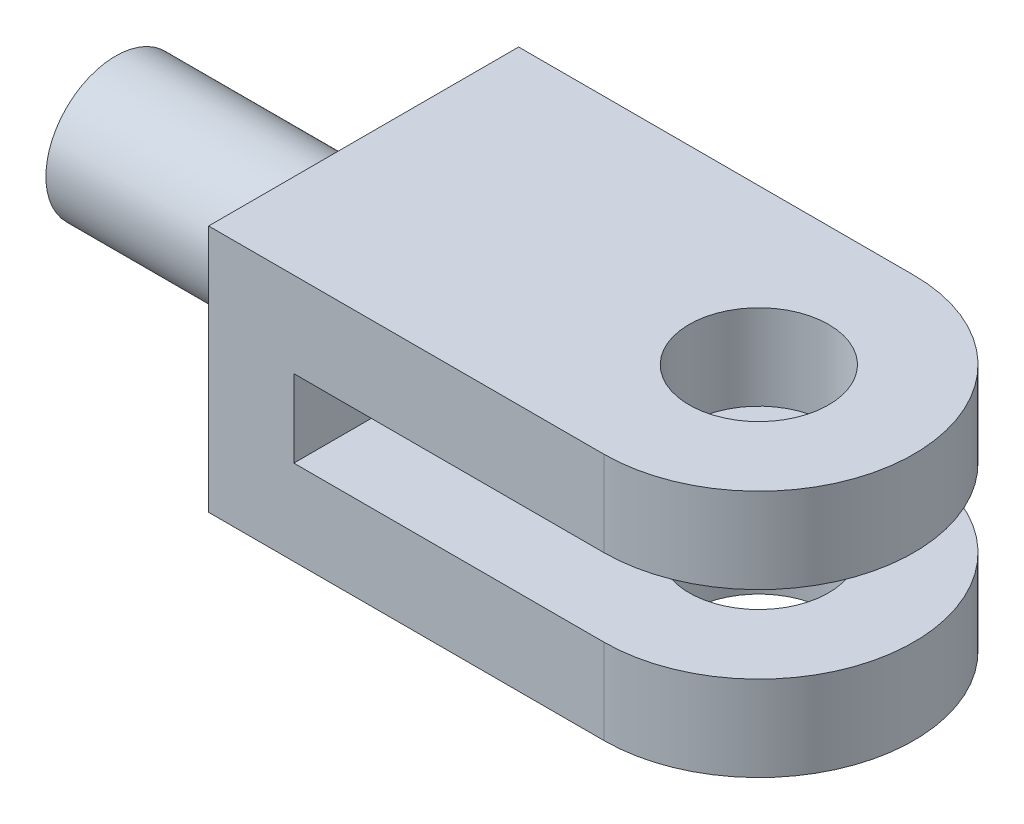
ISO-10303-21;
HEADER;
FILE_DESCRIPTION(('STEP AP214'),'2;1');
FILE_NAME('part.step','',(''),(''),'','','');
FILE_SCHEMA(('AUTOMOTIVE_DESIGN { 1 0 10303 214 1 1 1 1 }'));
ENDSEC;
DATA;
#1=APPLICATION_CONTEXT('core data for automotive mechanical design processes');
#2=APPLICATION_PROTOCOL_DEFINITION('international standard','automotive_design',2000,#1);
#3=PRODUCT_CONTEXT('',#1,'mechanical');
#4=PRODUCT('Part','Part','',(#3));
#5=PRODUCT_RELATED_PRODUCT_CATEGORY('part','',(#4));
#6=PRODUCT_DEFINITION_FORMATION('','',#4);
#7=PRODUCT_DEFINITION_CONTEXT('part definition',#1,'design');
#8=PRODUCT_DEFINITION('design','',#6,#7);
#9=PRODUCT_DEFINITION_SHAPE('','',#8);
#10=(LENGTH_UNIT() NAMED_UNIT(*) SI_UNIT(.MILLI.,.METRE.));
#11=(NAMED_UNIT(*) PLANE_ANGLE_UNIT() SI_UNIT($,.RADIAN.));
#12=(NAMED_UNIT(*) SI_UNIT($,.STERADIAN.) SOLID_ANGLE_UNIT());
#13=UNCERTAINTY_MEASURE_WITH_UNIT(LENGTH_MEASURE(1.E-05),#10,'distance_accuracy_value','');
#14=(GEOMETRIC_REPRESENTATION_CONTEXT(3) GLOBAL_UNCERTAINTY_ASSIGNED_CONTEXT((#13)) GLOBAL_UNIT_ASSIGNED_CONTEXT((#10,
#11,#12)) REPRESENTATION_CONTEXT('',''));
#15=CARTESIAN_POINT('',(0.,0.,0.));
#16=DIRECTION('',(0.,0.,1.));
#17=DIRECTION('',(1.,0.,0.));
#18=AXIS2_PLACEMENT_3D('',#15,#16,#17);
#19=CARTESIAN_POINT('',(32.,0.,0.));
#20=DIRECTION('',(-1.,0.,0.));
#21=DIRECTION('',(0.,0.,1.));
#22=AXIS2_PLACEMENT_3D('',#19,#20,#21);
#23=CYLINDRICAL_SURFACE('',#22,9.);
#24=CARTESIAN_POINT('',(32.,0.,0.));
#25=DIRECTION('',(1.,0.,0.));
#26=DIRECTION('',(0.,0.,-1.));
#27=AXIS2_PLACEMENT_3D('',#24,#25,#26);
#28=CIRCLE('',#27,9.);
#29=CARTESIAN_POINT('',(32.,0.,-9.));
#30=VERTEX_POINT('',#29);
#31=EDGE_CURVE('E11',#30,#30,#28,.T.);
#32=ORIENTED_EDGE('',*,*,#31,.F.);
#33=EDGE_LOOP('',(#32));
#34=FACE_BOUND('',#33,.T.);
#35=CARTESIAN_POINT('',(0.,0.,0.));
#36=DIRECTION('',(1.,0.,0.));
#37=DIRECTION('',(0.,0.,-1.));
#38=AXIS2_PLACEMENT_3D('',#35,#36,#37);
#39=CIRCLE('',#38,9.);
#40=CARTESIAN_POINT('',(0.,0.,-9.));
#41=VERTEX_POINT('',#40);
#42=EDGE_CURVE('E37',#41,#41,#39,.T.);
#43=ORIENTED_EDGE('',*,*,#42,.T.);
#44=EDGE_LOOP('',(#43));
#45=FACE_BOUND('',#44,.T.);
#46=ADVANCED_FACE('F34',(#34,#45),#23,.T.);
#47=CARTESIAN_POINT('',(0.,0.,0.));
#48=DIRECTION('',(1.,0.,0.));
#49=DIRECTION('',(0.,0.,-1.));
#50=AXIS2_PLACEMENT_3D('',#47,#48,#49);
#51=PLANE('',#50);
#52=ORIENTED_EDGE('',*,*,#42,.F.);
#53=EDGE_LOOP('',(#52));
#54=FACE_BOUND('',#53,.T.);
#55=ADVANCED_FACE('F211',(#54),#51,.F.);
#56=CARTESIAN_POINT('',(43.,16.,-20.));
#57=DIRECTION('',(0.,0.,1.));
#58=DIRECTION('',(0.,-1.,0.));
#59=AXIS2_PLACEMENT_3D('',#56,#57,#58);
#60=PLANE('',#59);
#61=DIRECTION('',(0.,1.,0.));
#62=VECTOR('',#61,1.);
#63=CARTESIAN_POINT('',(32.,16.,-20.));
#64=LINE('',#63,#62);
#65=CARTESIAN_POINT('',(32.,-16.,-20.));
#66=VERTEX_POINT('',#65);
#67=CARTESIAN_POINT('',(32.,16.,-20.));
#68=VERTEX_POINT('',#67);
#69=EDGE_CURVE('E105',#66,#68,#64,.T.);
#70=ORIENTED_EDGE('',*,*,#69,.T.);
#71=DIRECTION('',(-1.,0.,0.));
#72=VECTOR('',#71,1.);
#73=CARTESIAN_POINT('',(43.,16.,-20.));
#74=LINE('',#73,#72);
#75=CARTESIAN_POINT('',(83.,16.,-20.));
#76=VERTEX_POINT('',#75);
#77=EDGE_CURVE('E97',#76,#68,#74,.T.);
#78=ORIENTED_EDGE('',*,*,#77,.F.);
#79=DIRECTION('',(0.,-1.,0.));
#80=VECTOR('',#79,1.);
#81=CARTESIAN_POINT('',(83.,16.,-20.));
#82=LINE('',#81,#80);
#83=CARTESIAN_POINT('',(83.,5.,-20.));
#84=VERTEX_POINT('',#83);
#85=EDGE_CURVE('E101',#76,#84,#82,.T.);
#86=ORIENTED_EDGE('',*,*,#85,.T.);
#87=DIRECTION('',(-1.,0.,0.));
#88=VECTOR('',#87,1.);
#89=CARTESIAN_POINT('',(0.,5.,-20.));
#90=LINE('',#89,#88);
#91=CARTESIAN_POINT('',(43.,5.,-20.));
#92=VERTEX_POINT('',#91);
#93=EDGE_CURVE('E131',#84,#92,#90,.T.);
#94=ORIENTED_EDGE('',*,*,#93,.T.);
#95=DIRECTION('',(0.,1.,0.));
#96=VECTOR('',#95,1.);
#97=CARTESIAN_POINT('',(43.,16.,-20.));
#98=LINE('',#97,#96);
#99=CARTESIAN_POINT('',(43.,-5.,-20.));
#100=VERTEX_POINT('',#99);
#101=EDGE_CURVE('E164',#100,#92,#98,.T.);
#102=ORIENTED_EDGE('',*,*,#101,.F.);
#103=DIRECTION('',(-1.,0.,0.));
#104=VECTOR('',#103,1.);
#105=CARTESIAN_POINT('',(0.,-5.,-20.));
#106=LINE('',#105,#104);
#107=CARTESIAN_POINT('',(83.,-5.,-20.));
#108=VERTEX_POINT('',#107);
#109=EDGE_CURVE('E143',#108,#100,#106,.T.);
#110=ORIENTED_EDGE('',*,*,#109,.F.);
#111=DIRECTION('',(0.,-1.,0.));
#112=VECTOR('',#111,1.);
#113=CARTESIAN_POINT('',(83.,-5.,-20.));
#114=LINE('',#113,#112);
#115=CARTESIAN_POINT('',(83.,-16.,-20.));
#116=VERTEX_POINT('',#115);
#117=EDGE_CURVE('E154',#108,#116,#114,.T.);
#118=ORIENTED_EDGE('',*,*,#117,.T.);
#119=DIRECTION('',(-1.,0.,0.));
#120=VECTOR('',#119,1.);
#121=CARTESIAN_POINT('',(43.,-16.,-20.));
#122=LINE('',#121,#120);
#123=EDGE_CURVE('E169',#116,#66,#122,.T.);
#124=ORIENTED_EDGE('',*,*,#123,.T.);
#125=EDGE_LOOP('',(#70,#78,#86,#94,#102,#110,#118,#124));
#126=FACE_BOUND('',#125,.T.);
#127=ADVANCED_FACE('F99',(#126),#60,.F.);
#128=CARTESIAN_POINT('',(43.,16.,20.));
#129=DIRECTION('',(0.,-1.,0.));
#130=DIRECTION('',(0.,0.,-1.));
#131=AXIS2_PLACEMENT_3D('',#128,#129,#130);
#132=PLANE('',#131);
#133=DIRECTION('',(0.,0.,1.));
#134=VECTOR('',#133,1.);
#135=CARTESIAN_POINT('',(32.,16.,20.));
#136=LINE('',#135,#134);
#137=CARTESIAN_POINT('',(32.,16.,20.));
#138=VERTEX_POINT('',#137);
#139=EDGE_CURVE('E171',#68,#138,#136,.T.);
#140=ORIENTED_EDGE('',*,*,#139,.T.);
#141=DIRECTION('',(-1.,0.,0.));
#142=VECTOR('',#141,1.);
#143=CARTESIAN_POINT('',(43.,16.,20.));
#144=LINE('',#143,#142);
#145=CARTESIAN_POINT('',(83.,16.,20.));
#146=VERTEX_POINT('',#145);
#147=EDGE_CURVE('E108',#146,#138,#144,.T.);
#148=ORIENTED_EDGE('',*,*,#147,.F.);
#149=CARTESIAN_POINT('',(83.,16.,0.));
#150=DIRECTION('',(0.,-1.,0.));
#151=DIRECTION('',(0.,0.,-1.));
#152=AXIS2_PLACEMENT_3D('',#149,#150,#151);
#153=CIRCLE('',#152,20.);
#154=EDGE_CURVE('E114',#76,#146,#153,.T.);
#155=ORIENTED_EDGE('',*,*,#154,.F.);
#156=ORIENTED_EDGE('',*,*,#77,.T.);
#157=EDGE_LOOP('',(#140,#148,#155,#156));
#158=FACE_BOUND('',#157,.T.);
#159=CARTESIAN_POINT('',(83.,16.,0.));
#160=DIRECTION('',(0.,-1.,0.));
#161=DIRECTION('',(0.,0.,-1.));
#162=AXIS2_PLACEMENT_3D('',#159,#160,#161);
#163=CIRCLE('',#162,9.);
#164=CARTESIAN_POINT('',(83.,16.,-9.));
#165=VERTEX_POINT('',#164);
#166=EDGE_CURVE('E123',#165,#165,#163,.T.);
#167=ORIENTED_EDGE('',*,*,#166,.T.);
#168=EDGE_LOOP('',(#167));
#169=FACE_BOUND('',#168,.T.);
#170=ADVANCED_FACE('F119',(#158,#169),#132,.F.);
#171=CARTESIAN_POINT('',(43.,16.,20.));
#172=DIRECTION('',(0.,0.,-1.));
#173=DIRECTION('',(0.,1.,0.));
#174=AXIS2_PLACEMENT_3D('',#171,#172,#173);
#175=PLANE('',#174);
#176=DIRECTION('',(0.,-1.,0.));
#177=VECTOR('',#176,1.);
#178=CARTESIAN_POINT('',(32.,16.,20.));
#179=LINE('',#178,#177);
#180=CARTESIAN_POINT('',(32.,-16.,20.));
#181=VERTEX_POINT('',#180);
#182=EDGE_CURVE('E173',#138,#181,#179,.T.);
#183=ORIENTED_EDGE('',*,*,#182,.T.);
#184=DIRECTION('',(-1.,0.,0.));
#185=VECTOR('',#184,1.);
#186=CARTESIAN_POINT('',(43.,-16.,20.));
#187=LINE('',#186,#185);
#188=CARTESIAN_POINT('',(83.,-16.,20.));
#189=VERTEX_POINT('',#188);
#190=EDGE_CURVE('E177',#189,#181,#187,.T.);
#191=ORIENTED_EDGE('',*,*,#190,.F.);
#192=DIRECTION('',(0.,-1.,0.));
#193=VECTOR('',#192,1.);
#194=CARTESIAN_POINT('',(83.,-5.,20.));
#195=LINE('',#194,#193);
#196=CARTESIAN_POINT('',(83.,-5.,20.));
#197=VERTEX_POINT('',#196);
#198=EDGE_CURVE('E159',#197,#189,#195,.T.);
#199=ORIENTED_EDGE('',*,*,#198,.F.);
#200=DIRECTION('',(-1.,0.,0.));
#201=VECTOR('',#200,1.);
#202=CARTESIAN_POINT('',(0.,-5.,20.));
#203=LINE('',#202,#201);
#204=CARTESIAN_POINT('',(43.,-5.,20.));
#205=VERTEX_POINT('',#204);
#206=EDGE_CURVE('E150',#197,#205,#203,.T.);
#207=ORIENTED_EDGE('',*,*,#206,.T.);
#208=DIRECTION('',(0.,-1.,0.));
#209=VECTOR('',#208,1.);
#210=CARTESIAN_POINT('',(43.,16.,20.));
#211=LINE('',#210,#209);
#212=CARTESIAN_POINT('',(43.,5.,20.));
#213=VERTEX_POINT('',#212);
#214=EDGE_CURVE('E166',#213,#205,#211,.T.);
#215=ORIENTED_EDGE('',*,*,#214,.F.);
#216=DIRECTION('',(-1.,0.,0.));
#217=VECTOR('',#216,1.);
#218=CARTESIAN_POINT('',(0.,5.,20.));
#219=LINE('',#218,#217);
#220=CARTESIAN_POINT('',(83.,5.,20.));
#221=VERTEX_POINT('',#220);
#222=EDGE_CURVE('E134',#221,#213,#219,.T.);
#223=ORIENTED_EDGE('',*,*,#222,.F.);
#224=DIRECTION('',(0.,-1.,0.));
#225=VECTOR('',#224,1.);
#226=CARTESIAN_POINT('',(83.,16.,20.));
#227=LINE('',#226,#225);
#228=EDGE_CURVE('E117',#146,#221,#227,.T.);
#229=ORIENTED_EDGE('',*,*,#228,.F.);
#230=ORIENTED_EDGE('',*,*,#147,.T.);
#231=EDGE_LOOP('',(#183,#191,#199,#207,#215,#223,#229,#230));
#232=FACE_BOUND('',#231,.T.);
#233=ADVANCED_FACE('F182',(#232),#175,.F.);
#234=CARTESIAN_POINT('',(43.,-16.,20.));
#235=DIRECTION('',(0.,1.,0.));
#236=DIRECTION('',(0.,0.,1.));
#237=AXIS2_PLACEMENT_3D('',#234,#235,#236);
#238=PLANE('',#237);
#239=DIRECTION('',(0.,0.,-1.));
#240=VECTOR('',#239,1.);
#241=CARTESIAN_POINT('',(32.,-16.,20.));
#242=LINE('',#241,#240);
#243=EDGE_CURVE('E167',#181,#66,#242,.T.);
#244=ORIENTED_EDGE('',*,*,#243,.T.);
#245=ORIENTED_EDGE('',*,*,#123,.F.);
#246=CARTESIAN_POINT('',(83.,-16.,0.));
#247=DIRECTION('',(0.,-1.,0.));
#248=DIRECTION('',(0.,0.,-1.));
#249=AXIS2_PLACEMENT_3D('',#246,#247,#248);
#250=CIRCLE('',#249,20.);
#251=EDGE_CURVE('E144',#116,#189,#250,.T.);
#252=ORIENTED_EDGE('',*,*,#251,.T.);
#253=ORIENTED_EDGE('',*,*,#190,.T.);
#254=EDGE_LOOP('',(#244,#245,#252,#253));
#255=FACE_BOUND('',#254,.T.);
#256=CARTESIAN_POINT('',(83.,-16.,0.));
#257=DIRECTION('',(0.,-1.,0.));
#258=DIRECTION('',(0.,0.,-1.));
#259=AXIS2_PLACEMENT_3D('',#256,#257,#258);
#260=CIRCLE('',#259,9.);
#261=CARTESIAN_POINT('',(83.,-16.,-9.));
#262=VERTEX_POINT('',#261);
#263=EDGE_CURVE('E138',#262,#262,#260,.T.);
#264=ORIENTED_EDGE('',*,*,#263,.F.);
#265=EDGE_LOOP('',(#264));
#266=FACE_BOUND('',#265,.T.);
#267=ADVANCED_FACE('F188',(#255,#266),#238,.F.);
#268=CARTESIAN_POINT('',(43.,0.,0.));
#269=DIRECTION('',(1.,0.,0.));
#270=DIRECTION('',(0.,0.,-1.));
#271=AXIS2_PLACEMENT_3D('',#268,#269,#270);
#272=PLANE('',#271);
#273=DIRECTION('',(0.,0.,1.));
#274=VECTOR('',#273,1.);
#275=CARTESIAN_POINT('',(43.,5.,0.));
#276=LINE('',#275,#274);
#277=EDGE_CURVE('E48',#92,#213,#276,.T.);
#278=ORIENTED_EDGE('',*,*,#277,.T.);
#279=ORIENTED_EDGE('',*,*,#214,.T.);
#280=DIRECTION('',(0.,0.,1.));
#281=VECTOR('',#280,1.);
#282=CARTESIAN_POINT('',(43.,-5.,0.));
#283=LINE('',#282,#281);
#284=EDGE_CURVE('E53',#100,#205,#283,.T.);
#285=ORIENTED_EDGE('',*,*,#284,.F.);
#286=ORIENTED_EDGE('',*,*,#101,.T.);
#287=EDGE_LOOP('',(#278,#279,#285,#286));
#288=FACE_BOUND('',#287,.T.);
#289=ADVANCED_FACE('F223',(#288),#272,.T.);
#290=CARTESIAN_POINT('',(32.,0.,0.));
#291=DIRECTION('',(1.,0.,0.));
#292=DIRECTION('',(0.,0.,-1.));
#293=AXIS2_PLACEMENT_3D('',#290,#291,#292);
#294=PLANE('',#293);
#295=ORIENTED_EDGE('',*,*,#31,.T.);
#296=EDGE_LOOP('',(#295));
#297=FACE_BOUND('',#296,.T.);
#298=ORIENTED_EDGE('',*,*,#69,.F.);
#299=ORIENTED_EDGE('',*,*,#243,.F.);
#300=ORIENTED_EDGE('',*,*,#182,.F.);
#301=ORIENTED_EDGE('',*,*,#139,.F.);
#302=EDGE_LOOP('',(#298,#299,#300,#301));
#303=FACE_BOUND('',#302,.T.);
#304=ADVANCED_FACE('F186',(#297,#303),#294,.F.);
#305=CARTESIAN_POINT('',(83.,-5.,0.));
#306=DIRECTION('',(0.,-1.,0.));
#307=DIRECTION('',(0.,0.,-1.));
#308=AXIS2_PLACEMENT_3D('',#305,#306,#307);
#309=CYLINDRICAL_SURFACE('',#308,9.);
#310=CARTESIAN_POINT('',(83.,-5.,0.));
#311=DIRECTION('',(0.,-1.,0.));
#312=DIRECTION('',(0.,0.,-1.));
#313=AXIS2_PLACEMENT_3D('',#310,#311,#312);
#314=CIRCLE('',#313,9.);
#315=CARTESIAN_POINT('',(83.,-5.,-9.));
#316=VERTEX_POINT('',#315);
#317=EDGE_CURVE('E140',#316,#316,#314,.T.);
#318=ORIENTED_EDGE('',*,*,#317,.F.);
#319=EDGE_LOOP('',(#318));
#320=FACE_BOUND('',#319,.T.);
#321=ORIENTED_EDGE('',*,*,#263,.T.);
#322=EDGE_LOOP('',(#321));
#323=FACE_BOUND('',#322,.T.);
#324=ADVANCED_FACE('F208',(#320,#323),#309,.F.);
#325=CARTESIAN_POINT('',(83.,-5.,0.));
#326=DIRECTION('',(0.,-1.,0.));
#327=DIRECTION('',(0.,0.,-1.));
#328=AXIS2_PLACEMENT_3D('',#325,#326,#327);
#329=CYLINDRICAL_SURFACE('',#328,20.);
#330=ORIENTED_EDGE('',*,*,#251,.F.);
#331=ORIENTED_EDGE('',*,*,#117,.F.);
#332=CARTESIAN_POINT('',(83.,-5.,0.));
#333=DIRECTION('',(0.,-1.,0.));
#334=DIRECTION('',(0.,0.,-1.));
#335=AXIS2_PLACEMENT_3D('',#332,#333,#334);
#336=CIRCLE('',#335,20.);
#337=EDGE_CURVE('E147',#108,#197,#336,.T.);
#338=ORIENTED_EDGE('',*,*,#337,.T.);
#339=ORIENTED_EDGE('',*,*,#198,.T.);
#340=EDGE_LOOP('',(#330,#331,#338,#339));
#341=FACE_BOUND('',#340,.T.);
#342=ADVANCED_FACE('F194',(#341),#329,.T.);
#343=CARTESIAN_POINT('',(0.,-5.,0.));
#344=DIRECTION('',(0.,-1.,0.));
#345=DIRECTION('',(0.,0.,-1.));
#346=AXIS2_PLACEMENT_3D('',#343,#344,#345);
#347=PLANE('',#346);
#348=ORIENTED_EDGE('',*,*,#317,.T.);
#349=EDGE_LOOP('',(#348));
#350=FACE_BOUND('',#349,.T.);
#351=ORIENTED_EDGE('',*,*,#109,.T.);
#352=ORIENTED_EDGE('',*,*,#284,.T.);
#353=ORIENTED_EDGE('',*,*,#206,.F.);
#354=ORIENTED_EDGE('',*,*,#337,.F.);
#355=EDGE_LOOP('',(#351,#352,#353,#354));
#356=FACE_BOUND('',#355,.T.);
#357=ADVANCED_FACE('F197',(#350,#356),#347,.F.);
#358=CARTESIAN_POINT('',(83.,16.,0.));
#359=DIRECTION('',(0.,-1.,0.));
#360=DIRECTION('',(0.,0.,-1.));
#361=AXIS2_PLACEMENT_3D('',#358,#359,#360);
#362=CYLINDRICAL_SURFACE('',#361,9.);
#363=ORIENTED_EDGE('',*,*,#166,.F.);
#364=EDGE_LOOP('',(#363));
#365=FACE_BOUND('',#364,.T.);
#366=CARTESIAN_POINT('',(83.,5.,0.));
#367=DIRECTION('',(0.,-1.,0.));
#368=DIRECTION('',(0.,0.,-1.));
#369=AXIS2_PLACEMENT_3D('',#366,#367,#368);
#370=CIRCLE('',#369,9.);
#371=CARTESIAN_POINT('',(83.,5.,-9.));
#372=VERTEX_POINT('',#371);
#373=EDGE_CURVE('E128',#372,#372,#370,.T.);
#374=ORIENTED_EDGE('',*,*,#373,.T.);
#375=EDGE_LOOP('',(#374));
#376=FACE_BOUND('',#375,.T.);
#377=ADVANCED_FACE('F199',(#365,#376),#362,.F.);
#378=CARTESIAN_POINT('',(83.,16.,0.));
#379=DIRECTION('',(0.,-1.,0.));
#380=DIRECTION('',(0.,0.,-1.));
#381=AXIS2_PLACEMENT_3D('',#378,#379,#380);
#382=CYLINDRICAL_SURFACE('',#381,20.);
#383=CARTESIAN_POINT('',(83.,5.,0.));
#384=DIRECTION('',(0.,-1.,0.));
#385=DIRECTION('',(0.,0.,-1.));
#386=AXIS2_PLACEMENT_3D('',#383,#384,#385);
#387=CIRCLE('',#386,20.);
#388=EDGE_CURVE('E116',#84,#221,#387,.T.);
#389=ORIENTED_EDGE('',*,*,#388,.F.);
#390=ORIENTED_EDGE('',*,*,#85,.F.);
#391=ORIENTED_EDGE('',*,*,#154,.T.);
#392=ORIENTED_EDGE('',*,*,#228,.T.);
#393=EDGE_LOOP('',(#389,#390,#391,#392));
#394=FACE_BOUND('',#393,.T.);
#395=ADVANCED_FACE('F113',(#394),#382,.T.);
#396=CARTESIAN_POINT('',(0.,5.,0.));
#397=DIRECTION('',(0.,-1.,0.));
#398=DIRECTION('',(0.,0.,-1.));
#399=AXIS2_PLACEMENT_3D('',#396,#397,#398);
#400=PLANE('',#399);
#401=ORIENTED_EDGE('',*,*,#373,.F.);
#402=EDGE_LOOP('',(#401));
#403=FACE_BOUND('',#402,.T.);
#404=ORIENTED_EDGE('',*,*,#93,.F.);
#405=ORIENTED_EDGE('',*,*,#388,.T.);
#406=ORIENTED_EDGE('',*,*,#222,.T.);
#407=ORIENTED_EDGE('',*,*,#277,.F.);
#408=EDGE_LOOP('',(#404,#405,#406,#407));
#409=FACE_BOUND('',#408,.T.);
#410=ADVANCED_FACE('F278',(#403,#409),#400,.T.);
#411=CLOSED_SHELL('',(#46,#55,#127,#170,#233,#267,#289,#304,#324,#342,#357,#377,#395,#410));
#412=MANIFOLD_SOLID_BREP('B2',#411);
#413=ADVANCED_BREP_SHAPE_REPRESENTATION('',(#18,#412),#14);
#414=SHAPE_DEFINITION_REPRESENTATION(#9,#413);
ENDSEC;
END-ISO-10303-21;
